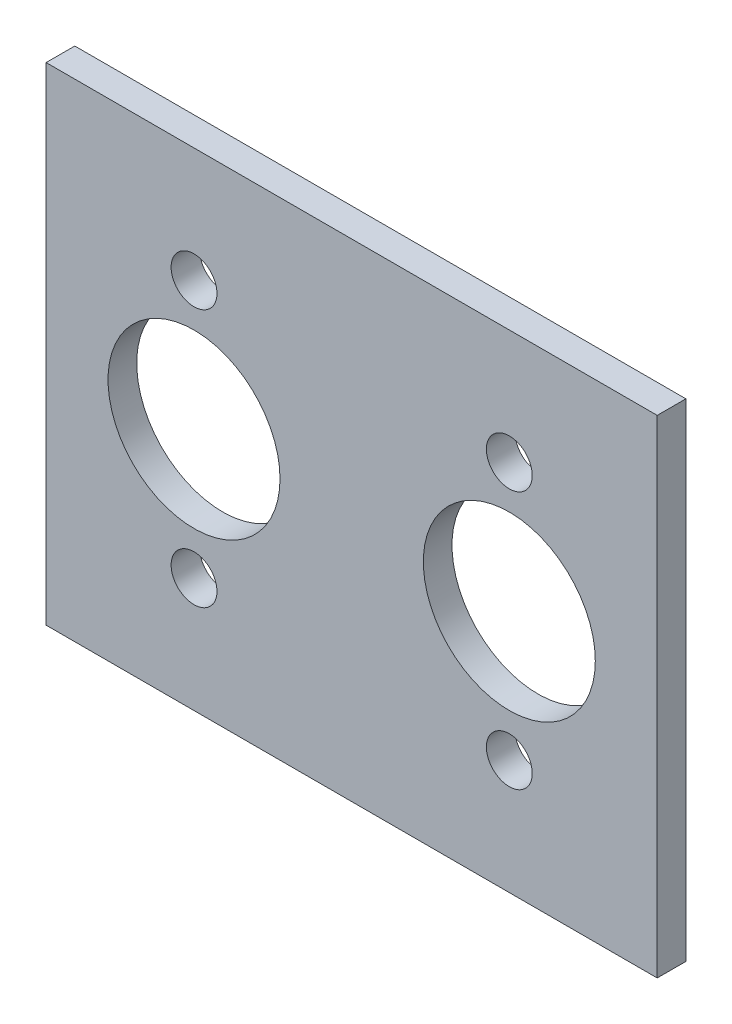
ISO-10303-21;
HEADER;
FILE_DESCRIPTION(('STEP AP214'),'2;1');
FILE_NAME('part.step','',(''),(''),'','','');
FILE_SCHEMA(('AUTOMOTIVE_DESIGN { 1 0 10303 214 1 1 1 1 }'));
ENDSEC;
DATA;
#1=APPLICATION_CONTEXT('core data for automotive mechanical design processes');
#2=APPLICATION_PROTOCOL_DEFINITION('international standard','automotive_design',2000,#1);
#3=PRODUCT_CONTEXT('',#1,'mechanical');
#4=PRODUCT('Part','Part','',(#3));
#5=PRODUCT_RELATED_PRODUCT_CATEGORY('part','',(#4));
#6=PRODUCT_DEFINITION_FORMATION('','',#4);
#7=PRODUCT_DEFINITION_CONTEXT('part definition',#1,'design');
#8=PRODUCT_DEFINITION('design','',#6,#7);
#9=PRODUCT_DEFINITION_SHAPE('','',#8);
#10=(LENGTH_UNIT() NAMED_UNIT(*) SI_UNIT(.MILLI.,.METRE.));
#11=(NAMED_UNIT(*) PLANE_ANGLE_UNIT() SI_UNIT($,.RADIAN.));
#12=(NAMED_UNIT(*) SI_UNIT($,.STERADIAN.) SOLID_ANGLE_UNIT());
#13=UNCERTAINTY_MEASURE_WITH_UNIT(LENGTH_MEASURE(1.E-05),#10,'distance_accuracy_value','');
#14=(GEOMETRIC_REPRESENTATION_CONTEXT(3) GLOBAL_UNCERTAINTY_ASSIGNED_CONTEXT((#13)) GLOBAL_UNIT_ASSIGNED_CONTEXT((#10,
#11,#12)) REPRESENTATION_CONTEXT('',''));
#15=CARTESIAN_POINT('',(0.,0.,0.));
#16=DIRECTION('',(0.,0.,1.));
#17=DIRECTION('',(1.,0.,0.));
#18=AXIS2_PLACEMENT_3D('',#15,#16,#17);
#19=CARTESIAN_POINT('',(53.3,-42.5,-5.));
#20=DIRECTION('',(1.,0.,0.));
#21=DIRECTION('',(0.,0.,-1.));
#22=AXIS2_PLACEMENT_3D('',#19,#20,#21);
#23=PLANE('',#22);
#24=DIRECTION('',(0.,1.,0.));
#25=VECTOR('',#24,1.);
#26=CARTESIAN_POINT('',(53.3,-42.5,0.));
#27=LINE('',#26,#25);
#28=CARTESIAN_POINT('',(53.3,-42.5,0.));
#29=VERTEX_POINT('',#28);
#30=CARTESIAN_POINT('',(53.3,42.5,0.));
#31=VERTEX_POINT('',#30);
#32=EDGE_CURVE('E104',#29,#31,#27,.T.);
#33=ORIENTED_EDGE('',*,*,#32,.F.);
#34=DIRECTION('',(0.,0.,1.));
#35=VECTOR('',#34,1.);
#36=CARTESIAN_POINT('',(53.3,-42.5,-5.));
#37=LINE('',#36,#35);
#38=CARTESIAN_POINT('',(53.3,-42.5,-5.));
#39=VERTEX_POINT('',#38);
#40=EDGE_CURVE('E11',#39,#29,#37,.T.);
#41=ORIENTED_EDGE('',*,*,#40,.F.);
#42=DIRECTION('',(0.,1.,0.));
#43=VECTOR('',#42,1.);
#44=CARTESIAN_POINT('',(53.3,-42.5,-5.));
#45=LINE('',#44,#43);
#46=CARTESIAN_POINT('',(53.3,42.5,-5.));
#47=VERTEX_POINT('',#46);
#48=EDGE_CURVE('E97',#39,#47,#45,.T.);
#49=ORIENTED_EDGE('',*,*,#48,.T.);
#50=DIRECTION('',(0.,0.,1.));
#51=VECTOR('',#50,1.);
#52=CARTESIAN_POINT('',(53.3,42.5,-5.));
#53=LINE('',#52,#51);
#54=EDGE_CURVE('E42',#47,#31,#53,.T.);
#55=ORIENTED_EDGE('',*,*,#54,.T.);
#56=EDGE_LOOP('',(#33,#41,#49,#55));
#57=FACE_BOUND('',#56,.T.);
#58=ADVANCED_FACE('F39',(#57),#23,.T.);
#59=CARTESIAN_POINT('',(-53.3,-42.5,-5.));
#60=DIRECTION('',(0.,-1.,0.));
#61=DIRECTION('',(0.,0.,-1.));
#62=AXIS2_PLACEMENT_3D('',#59,#60,#61);
#63=PLANE('',#62);
#64=DIRECTION('',(1.,0.,0.));
#65=VECTOR('',#64,1.);
#66=CARTESIAN_POINT('',(-53.3,-42.5,0.));
#67=LINE('',#66,#65);
#68=CARTESIAN_POINT('',(-53.3,-42.5,0.));
#69=VERTEX_POINT('',#68);
#70=EDGE_CURVE('E99',#69,#29,#67,.T.);
#71=ORIENTED_EDGE('',*,*,#70,.F.);
#72=DIRECTION('',(0.,0.,1.));
#73=VECTOR('',#72,1.);
#74=CARTESIAN_POINT('',(-53.3,-42.5,-5.));
#75=LINE('',#74,#73);
#76=CARTESIAN_POINT('',(-53.3,-42.5,-5.));
#77=VERTEX_POINT('',#76);
#78=EDGE_CURVE('E48',#77,#69,#75,.T.);
#79=ORIENTED_EDGE('',*,*,#78,.F.);
#80=DIRECTION('',(1.,0.,0.));
#81=VECTOR('',#80,1.);
#82=CARTESIAN_POINT('',(-53.3,-42.5,-5.));
#83=LINE('',#82,#81);
#84=EDGE_CURVE('E94',#77,#39,#83,.T.);
#85=ORIENTED_EDGE('',*,*,#84,.T.);
#86=ORIENTED_EDGE('',*,*,#40,.T.);
#87=EDGE_LOOP('',(#71,#79,#85,#86));
#88=FACE_BOUND('',#87,.T.);
#89=ADVANCED_FACE('F115',(#88),#63,.T.);
#90=CARTESIAN_POINT('',(-53.3,-42.5,-5.));
#91=DIRECTION('',(-1.,0.,0.));
#92=DIRECTION('',(0.,0.,1.));
#93=AXIS2_PLACEMENT_3D('',#90,#91,#92);
#94=PLANE('',#93);
#95=DIRECTION('',(0.,-1.,0.));
#96=VECTOR('',#95,1.);
#97=CARTESIAN_POINT('',(-53.3,-42.5,0.));
#98=LINE('',#97,#96);
#99=CARTESIAN_POINT('',(-53.3,42.5,0.));
#100=VERTEX_POINT('',#99);
#101=EDGE_CURVE('E89',#100,#69,#98,.T.);
#102=ORIENTED_EDGE('',*,*,#101,.F.);
#103=DIRECTION('',(0.,0.,1.));
#104=VECTOR('',#103,1.);
#105=CARTESIAN_POINT('',(-53.3,42.5,-5.));
#106=LINE('',#105,#104);
#107=CARTESIAN_POINT('',(-53.3,42.5,-5.));
#108=VERTEX_POINT('',#107);
#109=EDGE_CURVE('E84',#108,#100,#106,.T.);
#110=ORIENTED_EDGE('',*,*,#109,.F.);
#111=DIRECTION('',(0.,-1.,0.));
#112=VECTOR('',#111,1.);
#113=CARTESIAN_POINT('',(-53.3,-42.5,-5.));
#114=LINE('',#113,#112);
#115=EDGE_CURVE('E87',#108,#77,#114,.T.);
#116=ORIENTED_EDGE('',*,*,#115,.T.);
#117=ORIENTED_EDGE('',*,*,#78,.T.);
#118=EDGE_LOOP('',(#102,#110,#116,#117));
#119=FACE_BOUND('',#118,.T.);
#120=ADVANCED_FACE('F86',(#119),#94,.T.);
#121=CARTESIAN_POINT('',(-53.3,42.5,-5.));
#122=DIRECTION('',(0.,1.,0.));
#123=DIRECTION('',(0.,0.,1.));
#124=AXIS2_PLACEMENT_3D('',#121,#122,#123);
#125=PLANE('',#124);
#126=DIRECTION('',(-1.,0.,0.));
#127=VECTOR('',#126,1.);
#128=CARTESIAN_POINT('',(-53.3,42.5,0.));
#129=LINE('',#128,#127);
#130=EDGE_CURVE('E107',#31,#100,#129,.T.);
#131=ORIENTED_EDGE('',*,*,#130,.F.);
#132=ORIENTED_EDGE('',*,*,#54,.F.);
#133=DIRECTION('',(-1.,0.,0.));
#134=VECTOR('',#133,1.);
#135=CARTESIAN_POINT('',(-53.3,42.5,-5.));
#136=LINE('',#135,#134);
#137=EDGE_CURVE('E93',#47,#108,#136,.T.);
#138=ORIENTED_EDGE('',*,*,#137,.T.);
#139=ORIENTED_EDGE('',*,*,#109,.T.);
#140=EDGE_LOOP('',(#131,#132,#138,#139));
#141=FACE_BOUND('',#140,.T.);
#142=ADVANCED_FACE('F96',(#141),#125,.T.);
#143=CARTESIAN_POINT('',(0.,0.,-5.));
#144=DIRECTION('',(0.,0.,-1.));
#145=DIRECTION('',(-1.,0.,0.));
#146=AXIS2_PLACEMENT_3D('',#143,#144,#145);
#147=PLANE('',#146);
#148=CARTESIAN_POINT('',(27.5,-22.5,-5.));
#149=DIRECTION('',(0.,0.,1.));
#150=DIRECTION('',(1.,0.,0.));
#151=AXIS2_PLACEMENT_3D('',#148,#149,#150);
#152=CIRCLE('',#151,4.00000000000002);
#153=CARTESIAN_POINT('',(31.5,-22.5,-5.));
#154=VERTEX_POINT('',#153);
#155=EDGE_CURVE('E181',#154,#154,#152,.T.);
#156=ORIENTED_EDGE('',*,*,#155,.T.);
#157=EDGE_LOOP('',(#156));
#158=FACE_BOUND('',#157,.T.);
#159=CARTESIAN_POINT('',(27.5,22.5,-5.));
#160=DIRECTION('',(0.,0.,1.));
#161=DIRECTION('',(1.,0.,0.));
#162=AXIS2_PLACEMENT_3D('',#159,#160,#161);
#163=CIRCLE('',#162,4.00000000000002);
#164=CARTESIAN_POINT('',(31.5,22.5,-5.));
#165=VERTEX_POINT('',#164);
#166=EDGE_CURVE('E174',#165,#165,#163,.T.);
#167=ORIENTED_EDGE('',*,*,#166,.T.);
#168=EDGE_LOOP('',(#167));
#169=FACE_BOUND('',#168,.T.);
#170=CARTESIAN_POINT('',(-27.5,22.5,-5.));
#171=DIRECTION('',(0.,0.,1.));
#172=DIRECTION('',(1.,0.,0.));
#173=AXIS2_PLACEMENT_3D('',#170,#171,#172);
#174=CIRCLE('',#173,4.);
#175=CARTESIAN_POINT('',(-23.5,22.5,-5.));
#176=VERTEX_POINT('',#175);
#177=EDGE_CURVE('E192',#176,#176,#174,.T.);
#178=ORIENTED_EDGE('',*,*,#177,.T.);
#179=EDGE_LOOP('',(#178));
#180=FACE_BOUND('',#179,.T.);
#181=CARTESIAN_POINT('',(27.5,0.,-5.));
#182=DIRECTION('',(0.,0.,1.));
#183=DIRECTION('',(1.,0.,0.));
#184=AXIS2_PLACEMENT_3D('',#181,#182,#183);
#185=CIRCLE('',#184,15.);
#186=CARTESIAN_POINT('',(42.5,0.,-5.));
#187=VERTEX_POINT('',#186);
#188=EDGE_CURVE('E185',#187,#187,#185,.T.);
#189=ORIENTED_EDGE('',*,*,#188,.T.);
#190=EDGE_LOOP('',(#189));
#191=FACE_BOUND('',#190,.T.);
#192=CARTESIAN_POINT('',(-27.5,-22.5,-5.));
#193=DIRECTION('',(0.,0.,1.));
#194=DIRECTION('',(1.,0.,0.));
#195=AXIS2_PLACEMENT_3D('',#192,#193,#194);
#196=CIRCLE('',#195,4.);
#197=CARTESIAN_POINT('',(-23.5,-22.5,-5.));
#198=VERTEX_POINT('',#197);
#199=EDGE_CURVE('E165',#198,#198,#196,.T.);
#200=ORIENTED_EDGE('',*,*,#199,.T.);
#201=EDGE_LOOP('',(#200));
#202=FACE_BOUND('',#201,.T.);
#203=CARTESIAN_POINT('',(-27.5,0.,-5.));
#204=DIRECTION('',(0.,0.,1.));
#205=DIRECTION('',(1.,0.,0.));
#206=AXIS2_PLACEMENT_3D('',#203,#204,#205);
#207=CIRCLE('',#206,15.);
#208=CARTESIAN_POINT('',(-12.5,0.,-5.));
#209=VERTEX_POINT('',#208);
#210=EDGE_CURVE('E108',#209,#209,#207,.T.);
#211=ORIENTED_EDGE('',*,*,#210,.T.);
#212=EDGE_LOOP('',(#211));
#213=FACE_BOUND('',#212,.T.);
#214=ORIENTED_EDGE('',*,*,#48,.F.);
#215=ORIENTED_EDGE('',*,*,#84,.F.);
#216=ORIENTED_EDGE('',*,*,#115,.F.);
#217=ORIENTED_EDGE('',*,*,#137,.F.);
#218=EDGE_LOOP('',(#214,#215,#216,#217));
#219=FACE_BOUND('',#218,.T.);
#220=ADVANCED_FACE('F92',(#158,#169,#180,#191,#202,#213,#219),#147,.T.);
#221=CARTESIAN_POINT('',(0.,0.,0.));
#222=DIRECTION('',(0.,0.,-1.));
#223=DIRECTION('',(-1.,0.,0.));
#224=AXIS2_PLACEMENT_3D('',#221,#222,#223);
#225=PLANE('',#224);
#226=CARTESIAN_POINT('',(27.5,-22.5,0.));
#227=DIRECTION('',(0.,0.,1.));
#228=DIRECTION('',(1.,0.,0.));
#229=AXIS2_PLACEMENT_3D('',#226,#227,#228);
#230=CIRCLE('',#229,4.00000000000002);
#231=CARTESIAN_POINT('',(31.5,-22.5,0.));
#232=VERTEX_POINT('',#231);
#233=EDGE_CURVE('E171',#232,#232,#230,.T.);
#234=ORIENTED_EDGE('',*,*,#233,.F.);
#235=EDGE_LOOP('',(#234));
#236=FACE_BOUND('',#235,.T.);
#237=CARTESIAN_POINT('',(27.5,22.5,0.));
#238=DIRECTION('',(0.,0.,1.));
#239=DIRECTION('',(1.,0.,0.));
#240=AXIS2_PLACEMENT_3D('',#237,#238,#239);
#241=CIRCLE('',#240,4.00000000000002);
#242=CARTESIAN_POINT('',(31.5,22.5,0.));
#243=VERTEX_POINT('',#242);
#244=EDGE_CURVE('E178',#243,#243,#241,.T.);
#245=ORIENTED_EDGE('',*,*,#244,.F.);
#246=EDGE_LOOP('',(#245));
#247=FACE_BOUND('',#246,.T.);
#248=CARTESIAN_POINT('',(-27.5,22.5,0.));
#249=DIRECTION('',(0.,0.,1.));
#250=DIRECTION('',(1.,0.,0.));
#251=AXIS2_PLACEMENT_3D('',#248,#249,#250);
#252=CIRCLE('',#251,4.);
#253=CARTESIAN_POINT('',(-23.5,22.5,0.));
#254=VERTEX_POINT('',#253);
#255=EDGE_CURVE('E177',#254,#254,#252,.T.);
#256=ORIENTED_EDGE('',*,*,#255,.F.);
#257=EDGE_LOOP('',(#256));
#258=FACE_BOUND('',#257,.T.);
#259=CARTESIAN_POINT('',(27.5,0.,0.));
#260=DIRECTION('',(0.,0.,1.));
#261=DIRECTION('',(1.,0.,0.));
#262=AXIS2_PLACEMENT_3D('',#259,#260,#261);
#263=CIRCLE('',#262,15.);
#264=CARTESIAN_POINT('',(42.5,0.,0.));
#265=VERTEX_POINT('',#264);
#266=EDGE_CURVE('E189',#265,#265,#263,.T.);
#267=ORIENTED_EDGE('',*,*,#266,.F.);
#268=EDGE_LOOP('',(#267));
#269=FACE_BOUND('',#268,.T.);
#270=CARTESIAN_POINT('',(-27.5,-22.5,0.));
#271=DIRECTION('',(0.,0.,1.));
#272=DIRECTION('',(1.,0.,0.));
#273=AXIS2_PLACEMENT_3D('',#270,#271,#272);
#274=CIRCLE('',#273,4.);
#275=CARTESIAN_POINT('',(-23.5,-22.5,0.));
#276=VERTEX_POINT('',#275);
#277=EDGE_CURVE('E168',#276,#276,#274,.T.);
#278=ORIENTED_EDGE('',*,*,#277,.F.);
#279=EDGE_LOOP('',(#278));
#280=FACE_BOUND('',#279,.T.);
#281=CARTESIAN_POINT('',(-27.5,0.,0.));
#282=DIRECTION('',(0.,0.,1.));
#283=DIRECTION('',(1.,0.,0.));
#284=AXIS2_PLACEMENT_3D('',#281,#282,#283);
#285=CIRCLE('',#284,15.);
#286=CARTESIAN_POINT('',(-12.5,0.,0.));
#287=VERTEX_POINT('',#286);
#288=EDGE_CURVE('E188',#287,#287,#285,.T.);
#289=ORIENTED_EDGE('',*,*,#288,.F.);
#290=EDGE_LOOP('',(#289));
#291=FACE_BOUND('',#290,.T.);
#292=ORIENTED_EDGE('',*,*,#32,.T.);
#293=ORIENTED_EDGE('',*,*,#130,.T.);
#294=ORIENTED_EDGE('',*,*,#101,.T.);
#295=ORIENTED_EDGE('',*,*,#70,.T.);
#296=EDGE_LOOP('',(#292,#293,#294,#295));
#297=FACE_BOUND('',#296,.T.);
#298=ADVANCED_FACE('F114',(#236,#247,#258,#269,#280,#291,#297),#225,.F.);
#299=CARTESIAN_POINT('',(-27.5,0.,-5.));
#300=DIRECTION('',(0.,0.,1.));
#301=DIRECTION('',(1.,0.,0.));
#302=AXIS2_PLACEMENT_3D('',#299,#300,#301);
#303=CYLINDRICAL_SURFACE('',#302,15.);
#304=ORIENTED_EDGE('',*,*,#210,.F.);
#305=EDGE_LOOP('',(#304));
#306=FACE_BOUND('',#305,.T.);
#307=ORIENTED_EDGE('',*,*,#288,.T.);
#308=EDGE_LOOP('',(#307));
#309=FACE_BOUND('',#308,.T.);
#310=ADVANCED_FACE('F133',(#306,#309),#303,.F.);
#311=CARTESIAN_POINT('',(-27.5,-22.5,-5.));
#312=DIRECTION('',(0.,0.,1.));
#313=DIRECTION('',(1.,0.,0.));
#314=AXIS2_PLACEMENT_3D('',#311,#312,#313);
#315=CYLINDRICAL_SURFACE('',#314,4.);
#316=ORIENTED_EDGE('',*,*,#199,.F.);
#317=EDGE_LOOP('',(#316));
#318=FACE_BOUND('',#317,.T.);
#319=ORIENTED_EDGE('',*,*,#277,.T.);
#320=EDGE_LOOP('',(#319));
#321=FACE_BOUND('',#320,.T.);
#322=ADVANCED_FACE('F140',(#318,#321),#315,.F.);
#323=CARTESIAN_POINT('',(27.5,0.,-5.));
#324=DIRECTION('',(0.,0.,1.));
#325=DIRECTION('',(1.,0.,0.));
#326=AXIS2_PLACEMENT_3D('',#323,#324,#325);
#327=CYLINDRICAL_SURFACE('',#326,15.);
#328=ORIENTED_EDGE('',*,*,#188,.F.);
#329=EDGE_LOOP('',(#328));
#330=FACE_BOUND('',#329,.T.);
#331=ORIENTED_EDGE('',*,*,#266,.T.);
#332=EDGE_LOOP('',(#331));
#333=FACE_BOUND('',#332,.T.);
#334=ADVANCED_FACE('F146',(#330,#333),#327,.F.);
#335=CARTESIAN_POINT('',(-27.5,22.5,-5.));
#336=DIRECTION('',(0.,0.,1.));
#337=DIRECTION('',(1.,0.,0.));
#338=AXIS2_PLACEMENT_3D('',#335,#336,#337);
#339=CYLINDRICAL_SURFACE('',#338,4.);
#340=ORIENTED_EDGE('',*,*,#177,.F.);
#341=EDGE_LOOP('',(#340));
#342=FACE_BOUND('',#341,.T.);
#343=ORIENTED_EDGE('',*,*,#255,.T.);
#344=EDGE_LOOP('',(#343));
#345=FACE_BOUND('',#344,.T.);
#346=ADVANCED_FACE('F142',(#342,#345),#339,.F.);
#347=CARTESIAN_POINT('',(27.5,22.5,-5.));
#348=DIRECTION('',(0.,0.,1.));
#349=DIRECTION('',(1.,0.,0.));
#350=AXIS2_PLACEMENT_3D('',#347,#348,#349);
#351=CYLINDRICAL_SURFACE('',#350,4.00000000000002);
#352=ORIENTED_EDGE('',*,*,#166,.F.);
#353=EDGE_LOOP('',(#352));
#354=FACE_BOUND('',#353,.T.);
#355=ORIENTED_EDGE('',*,*,#244,.T.);
#356=EDGE_LOOP('',(#355));
#357=FACE_BOUND('',#356,.T.);
#358=ADVANCED_FACE('F145',(#354,#357),#351,.F.);
#359=CARTESIAN_POINT('',(27.5,-22.5,-5.));
#360=DIRECTION('',(0.,0.,1.));
#361=DIRECTION('',(1.,0.,0.));
#362=AXIS2_PLACEMENT_3D('',#359,#360,#361);
#363=CYLINDRICAL_SURFACE('',#362,4.00000000000002);
#364=ORIENTED_EDGE('',*,*,#155,.F.);
#365=EDGE_LOOP('',(#364));
#366=FACE_BOUND('',#365,.T.);
#367=ORIENTED_EDGE('',*,*,#233,.T.);
#368=EDGE_LOOP('',(#367));
#369=FACE_BOUND('',#368,.T.);
#370=ADVANCED_FACE('F151',(#366,#369),#363,.F.);
#371=CLOSED_SHELL('',(#58,#89,#120,#142,#220,#298,#310,#322,#334,#346,#358,#370));
#372=MANIFOLD_SOLID_BREP('B2',#371);
#373=ADVANCED_BREP_SHAPE_REPRESENTATION('',(#18,#372),#14);
#374=SHAPE_DEFINITION_REPRESENTATION(#9,#373);
ENDSEC;
END-ISO-10303-21;
